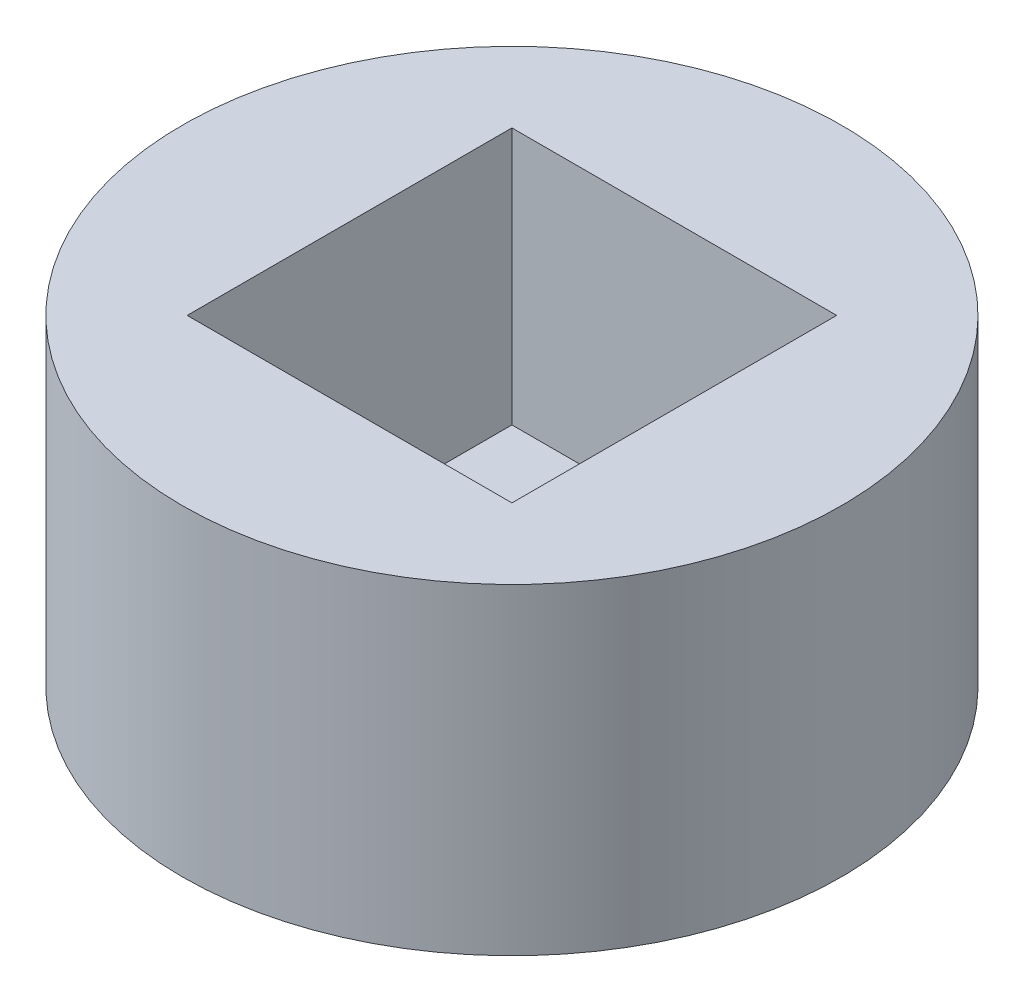
ISO-10303-21;
HEADER;
FILE_DESCRIPTION(('STEP AP214'),'2;1');
FILE_NAME('part.step','',(''),(''),'','','');
FILE_SCHEMA(('AUTOMOTIVE_DESIGN { 1 0 10303 214 1 1 1 1 }'));
ENDSEC;
DATA;
#1=APPLICATION_CONTEXT('core data for automotive mechanical design processes');
#2=APPLICATION_PROTOCOL_DEFINITION('international standard','automotive_design',2000,#1);
#3=PRODUCT_CONTEXT('',#1,'mechanical');
#4=PRODUCT('Part','Part','',(#3));
#5=PRODUCT_RELATED_PRODUCT_CATEGORY('part','',(#4));
#6=PRODUCT_DEFINITION_FORMATION('','',#4);
#7=PRODUCT_DEFINITION_CONTEXT('part definition',#1,'design');
#8=PRODUCT_DEFINITION('design','',#6,#7);
#9=PRODUCT_DEFINITION_SHAPE('','',#8);
#10=(LENGTH_UNIT() NAMED_UNIT(*) SI_UNIT(.MILLI.,.METRE.));
#11=(NAMED_UNIT(*) PLANE_ANGLE_UNIT() SI_UNIT($,.RADIAN.));
#12=(NAMED_UNIT(*) SI_UNIT($,.STERADIAN.) SOLID_ANGLE_UNIT());
#13=UNCERTAINTY_MEASURE_WITH_UNIT(LENGTH_MEASURE(1.E-05),#10,'distance_accuracy_value','');
#14=(GEOMETRIC_REPRESENTATION_CONTEXT(3) GLOBAL_UNCERTAINTY_ASSIGNED_CONTEXT((#13)) GLOBAL_UNIT_ASSIGNED_CONTEXT((#10,
#11,#12)) REPRESENTATION_CONTEXT('',''));
#15=CARTESIAN_POINT('',(0.,0.,0.));
#16=DIRECTION('',(0.,0.,1.));
#17=DIRECTION('',(1.,0.,0.));
#18=AXIS2_PLACEMENT_3D('',#15,#16,#17);
#19=CARTESIAN_POINT('',(0.,25.4,0.));
#20=DIRECTION('',(0.,-1.,0.));
#21=DIRECTION('',(0.,0.,-1.));
#22=AXIS2_PLACEMENT_3D('',#19,#20,#21);
#23=CYLINDRICAL_SURFACE('',#22,26.035);
#24=CARTESIAN_POINT('',(0.,25.4,0.));
#25=DIRECTION('',(0.,1.,0.));
#26=DIRECTION('',(0.,0.,1.));
#27=AXIS2_PLACEMENT_3D('',#24,#25,#26);
#28=CIRCLE('',#27,26.035);
#29=CARTESIAN_POINT('',(0.,25.4,26.035));
#30=VERTEX_POINT('',#29);
#31=EDGE_CURVE('E11',#30,#30,#28,.T.);
#32=ORIENTED_EDGE('',*,*,#31,.F.);
#33=EDGE_LOOP('',(#32));
#34=FACE_BOUND('',#33,.T.);
#35=CARTESIAN_POINT('',(0.,0.,0.));
#36=DIRECTION('',(0.,1.,0.));
#37=DIRECTION('',(0.,0.,1.));
#38=AXIS2_PLACEMENT_3D('',#35,#36,#37);
#39=CIRCLE('',#38,26.035);
#40=CARTESIAN_POINT('',(0.,0.,26.035));
#41=VERTEX_POINT('',#40);
#42=EDGE_CURVE('E48',#41,#41,#39,.T.);
#43=ORIENTED_EDGE('',*,*,#42,.T.);
#44=EDGE_LOOP('',(#43));
#45=FACE_BOUND('',#44,.T.);
#46=ADVANCED_FACE('F45',(#34,#45),#23,.T.);
#47=CARTESIAN_POINT('',(0.,25.4,0.));
#48=DIRECTION('',(0.,1.,0.));
#49=DIRECTION('',(0.,0.,1.));
#50=AXIS2_PLACEMENT_3D('',#47,#48,#49);
#51=PLANE('',#50);
#52=DIRECTION('',(0.,0.,-1.));
#53=VECTOR('',#52,1.);
#54=CARTESIAN_POINT('',(12.827,25.4,12.827));
#55=LINE('',#54,#53);
#56=CARTESIAN_POINT('',(12.827,25.4,12.827));
#57=VERTEX_POINT('',#56);
#58=CARTESIAN_POINT('',(12.827,25.4,-12.827));
#59=VERTEX_POINT('',#58);
#60=EDGE_CURVE('E60',#57,#59,#55,.T.);
#61=ORIENTED_EDGE('',*,*,#60,.F.);
#62=DIRECTION('',(1.,0.,0.));
#63=VECTOR('',#62,1.);
#64=CARTESIAN_POINT('',(-12.827,25.4,12.827));
#65=LINE('',#64,#63);
#66=CARTESIAN_POINT('',(-12.827,25.4,12.827));
#67=VERTEX_POINT('',#66);
#68=EDGE_CURVE('E115',#67,#57,#65,.T.);
#69=ORIENTED_EDGE('',*,*,#68,.F.);
#70=DIRECTION('',(0.,0.,1.));
#71=VECTOR('',#70,1.);
#72=CARTESIAN_POINT('',(-12.827,25.4,12.827));
#73=LINE('',#72,#71);
#74=CARTESIAN_POINT('',(-12.827,25.4,-12.827));
#75=VERTEX_POINT('',#74);
#76=EDGE_CURVE('E124',#75,#67,#73,.T.);
#77=ORIENTED_EDGE('',*,*,#76,.F.);
#78=DIRECTION('',(-1.,0.,0.));
#79=VECTOR('',#78,1.);
#80=CARTESIAN_POINT('',(-12.827,25.4,-12.827));
#81=LINE('',#80,#79);
#82=EDGE_CURVE('E95',#59,#75,#81,.T.);
#83=ORIENTED_EDGE('',*,*,#82,.F.);
#84=EDGE_LOOP('',(#61,#69,#77,#83));
#85=FACE_BOUND('',#84,.T.);
#86=ORIENTED_EDGE('',*,*,#31,.T.);
#87=EDGE_LOOP('',(#86));
#88=FACE_BOUND('',#87,.T.);
#89=ADVANCED_FACE('F135',(#85,#88),#51,.T.);
#90=CARTESIAN_POINT('',(0.,0.,0.));
#91=DIRECTION('',(0.,1.,0.));
#92=DIRECTION('',(0.,0.,1.));
#93=AXIS2_PLACEMENT_3D('',#90,#91,#92);
#94=PLANE('',#93);
#95=ORIENTED_EDGE('',*,*,#42,.F.);
#96=EDGE_LOOP('',(#95));
#97=FACE_BOUND('',#96,.T.);
#98=ADVANCED_FACE('F147',(#97),#94,.F.);
#99=CARTESIAN_POINT('',(12.827,5.08,12.827));
#100=DIRECTION('',(1.,0.,0.));
#101=DIRECTION('',(0.,0.,-1.));
#102=AXIS2_PLACEMENT_3D('',#99,#100,#101);
#103=PLANE('',#102);
#104=ORIENTED_EDGE('',*,*,#60,.T.);
#105=DIRECTION('',(0.,1.,0.));
#106=VECTOR('',#105,1.);
#107=CARTESIAN_POINT('',(12.827,5.08,-12.827));
#108=LINE('',#107,#106);
#109=CARTESIAN_POINT('',(12.827,5.08,-12.827));
#110=VERTEX_POINT('',#109);
#111=EDGE_CURVE('E83',#110,#59,#108,.T.);
#112=ORIENTED_EDGE('',*,*,#111,.F.);
#113=DIRECTION('',(0.,0.,-1.));
#114=VECTOR('',#113,1.);
#115=CARTESIAN_POINT('',(12.827,5.08,12.827));
#116=LINE('',#115,#114);
#117=CARTESIAN_POINT('',(12.827,5.08,12.827));
#118=VERTEX_POINT('',#117);
#119=EDGE_CURVE('E111',#118,#110,#116,.T.);
#120=ORIENTED_EDGE('',*,*,#119,.F.);
#121=DIRECTION('',(0.,1.,0.));
#122=VECTOR('',#121,1.);
#123=CARTESIAN_POINT('',(12.827,5.08,12.827));
#124=LINE('',#123,#122);
#125=EDGE_CURVE('E68',#118,#57,#124,.T.);
#126=ORIENTED_EDGE('',*,*,#125,.T.);
#127=EDGE_LOOP('',(#104,#112,#120,#126));
#128=FACE_BOUND('',#127,.T.);
#129=ADVANCED_FACE('F140',(#128),#103,.F.);
#130=CARTESIAN_POINT('',(-12.827,5.08,12.827));
#131=DIRECTION('',(0.,0.,1.));
#132=DIRECTION('',(1.,0.,0.));
#133=AXIS2_PLACEMENT_3D('',#130,#131,#132);
#134=PLANE('',#133);
#135=ORIENTED_EDGE('',*,*,#68,.T.);
#136=ORIENTED_EDGE('',*,*,#125,.F.);
#137=DIRECTION('',(1.,0.,0.));
#138=VECTOR('',#137,1.);
#139=CARTESIAN_POINT('',(-12.827,5.08,12.827));
#140=LINE('',#139,#138);
#141=CARTESIAN_POINT('',(-12.827,5.08,12.827));
#142=VERTEX_POINT('',#141);
#143=EDGE_CURVE('E108',#142,#118,#140,.T.);
#144=ORIENTED_EDGE('',*,*,#143,.F.);
#145=DIRECTION('',(0.,1.,0.));
#146=VECTOR('',#145,1.);
#147=CARTESIAN_POINT('',(-12.827,5.08,12.827));
#148=LINE('',#147,#146);
#149=EDGE_CURVE('E100',#142,#67,#148,.T.);
#150=ORIENTED_EDGE('',*,*,#149,.T.);
#151=EDGE_LOOP('',(#135,#136,#144,#150));
#152=FACE_BOUND('',#151,.T.);
#153=ADVANCED_FACE('F138',(#152),#134,.F.);
#154=CARTESIAN_POINT('',(-12.827,5.08,12.827));
#155=DIRECTION('',(-1.,0.,0.));
#156=DIRECTION('',(0.,0.,1.));
#157=AXIS2_PLACEMENT_3D('',#154,#155,#156);
#158=PLANE('',#157);
#159=ORIENTED_EDGE('',*,*,#76,.T.);
#160=ORIENTED_EDGE('',*,*,#149,.F.);
#161=DIRECTION('',(0.,0.,1.));
#162=VECTOR('',#161,1.);
#163=CARTESIAN_POINT('',(-12.827,5.08,12.827));
#164=LINE('',#163,#162);
#165=CARTESIAN_POINT('',(-12.827,5.08,-12.827));
#166=VERTEX_POINT('',#165);
#167=EDGE_CURVE('E103',#166,#142,#164,.T.);
#168=ORIENTED_EDGE('',*,*,#167,.F.);
#169=DIRECTION('',(0.,1.,0.));
#170=VECTOR('',#169,1.);
#171=CARTESIAN_POINT('',(-12.827,5.08,-12.827));
#172=LINE('',#171,#170);
#173=EDGE_CURVE('E88',#166,#75,#172,.T.);
#174=ORIENTED_EDGE('',*,*,#173,.T.);
#175=EDGE_LOOP('',(#159,#160,#168,#174));
#176=FACE_BOUND('',#175,.T.);
#177=ADVANCED_FACE('F104',(#176),#158,.F.);
#178=CARTESIAN_POINT('',(-12.827,5.08,-12.827));
#179=DIRECTION('',(0.,0.,-1.));
#180=DIRECTION('',(-1.,0.,0.));
#181=AXIS2_PLACEMENT_3D('',#178,#179,#180);
#182=PLANE('',#181);
#183=ORIENTED_EDGE('',*,*,#82,.T.);
#184=ORIENTED_EDGE('',*,*,#173,.F.);
#185=DIRECTION('',(-1.,0.,0.));
#186=VECTOR('',#185,1.);
#187=CARTESIAN_POINT('',(-12.827,5.08,-12.827));
#188=LINE('',#187,#186);
#189=EDGE_CURVE('E92',#110,#166,#188,.T.);
#190=ORIENTED_EDGE('',*,*,#189,.F.);
#191=ORIENTED_EDGE('',*,*,#111,.T.);
#192=EDGE_LOOP('',(#183,#184,#190,#191));
#193=FACE_BOUND('',#192,.T.);
#194=ADVANCED_FACE('F90',(#193),#182,.F.);
#195=CARTESIAN_POINT('',(0.,5.08,0.));
#196=DIRECTION('',(0.,-1.,0.));
#197=DIRECTION('',(0.,0.,-1.));
#198=AXIS2_PLACEMENT_3D('',#195,#196,#197);
#199=PLANE('',#198);
#200=ORIENTED_EDGE('',*,*,#119,.T.);
#201=ORIENTED_EDGE('',*,*,#189,.T.);
#202=ORIENTED_EDGE('',*,*,#167,.T.);
#203=ORIENTED_EDGE('',*,*,#143,.T.);
#204=EDGE_LOOP('',(#200,#201,#202,#203));
#205=FACE_BOUND('',#204,.T.);
#206=ADVANCED_FACE('F110',(#205),#199,.F.);
#207=CLOSED_SHELL('',(#46,#89,#98,#129,#153,#177,#194,#206));
#208=MANIFOLD_SOLID_BREP('B2',#207);
#209=ADVANCED_BREP_SHAPE_REPRESENTATION('',(#18,#208),#14);
#210=SHAPE_DEFINITION_REPRESENTATION(#9,#209);
ENDSEC;
END-ISO-10303-21;
